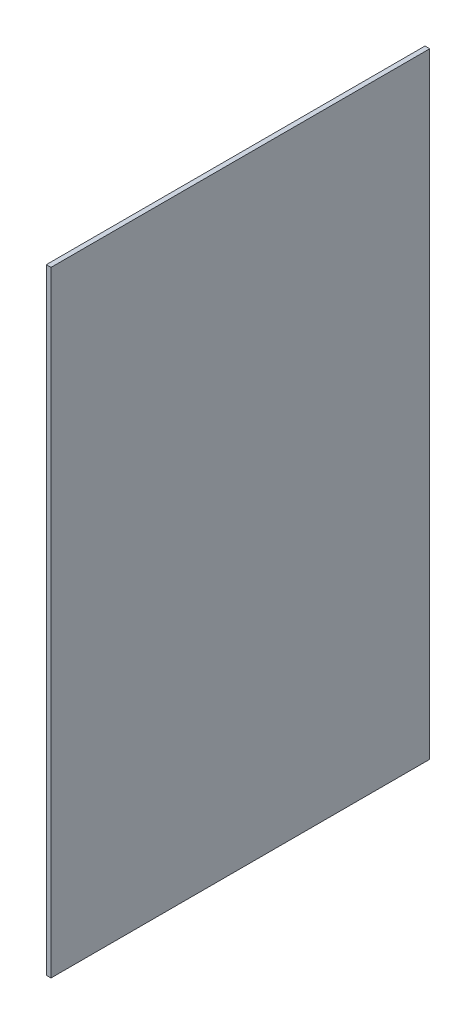
ISO-10303-21;
HEADER;
FILE_DESCRIPTION(('STEP AP214'),'2;1');
FILE_NAME('part.step','',(''),(''),'','','');
FILE_SCHEMA(('AUTOMOTIVE_DESIGN { 1 0 10303 214 1 1 1 1 }'));
ENDSEC;
DATA;
#1=APPLICATION_CONTEXT('core data for automotive mechanical design processes');
#2=APPLICATION_PROTOCOL_DEFINITION('international standard','automotive_design',2000,#1);
#3=PRODUCT_CONTEXT('',#1,'mechanical');
#4=PRODUCT('Part','Part','',(#3));
#5=PRODUCT_RELATED_PRODUCT_CATEGORY('part','',(#4));
#6=PRODUCT_DEFINITION_FORMATION('','',#4);
#7=PRODUCT_DEFINITION_CONTEXT('part definition',#1,'design');
#8=PRODUCT_DEFINITION('design','',#6,#7);
#9=PRODUCT_DEFINITION_SHAPE('','',#8);
#10=(LENGTH_UNIT() NAMED_UNIT(*) SI_UNIT(.MILLI.,.METRE.));
#11=(NAMED_UNIT(*) PLANE_ANGLE_UNIT() SI_UNIT($,.RADIAN.));
#12=(NAMED_UNIT(*) SI_UNIT($,.STERADIAN.) SOLID_ANGLE_UNIT());
#13=UNCERTAINTY_MEASURE_WITH_UNIT(LENGTH_MEASURE(1.E-05),#10,'distance_accuracy_value','');
#14=(GEOMETRIC_REPRESENTATION_CONTEXT(3) GLOBAL_UNCERTAINTY_ASSIGNED_CONTEXT((#13)) GLOBAL_UNIT_ASSIGNED_CONTEXT((#10,
#11,#12)) REPRESENTATION_CONTEXT('',''));
#15=CARTESIAN_POINT('',(0.,0.,0.));
#16=DIRECTION('',(0.,0.,1.));
#17=DIRECTION('',(1.,0.,0.));
#18=AXIS2_PLACEMENT_3D('',#15,#16,#17);
#19=CARTESIAN_POINT('',(0.,650.,400.));
#20=DIRECTION('',(1.,0.,0.));
#21=DIRECTION('',(0.,0.,-1.));
#22=AXIS2_PLACEMENT_3D('',#19,#20,#21);
#23=PLANE('',#22);
#24=DIRECTION('',(0.,-1.,0.));
#25=VECTOR('',#24,1.);
#26=CARTESIAN_POINT('',(0.,650.,0.));
#27=LINE('',#26,#25);
#28=CARTESIAN_POINT('',(0.,650.,0.));
#29=VERTEX_POINT('',#28);
#30=CARTESIAN_POINT('',(0.,0.,0.));
#31=VERTEX_POINT('',#30);
#32=EDGE_CURVE('E102',#29,#31,#27,.T.);
#33=ORIENTED_EDGE('',*,*,#32,.T.);
#34=DIRECTION('',(0.,0.,-1.));
#35=VECTOR('',#34,1.);
#36=CARTESIAN_POINT('',(0.,0.,400.));
#37=LINE('',#36,#35);
#38=CARTESIAN_POINT('',(0.,0.,400.));
#39=VERTEX_POINT('',#38);
#40=EDGE_CURVE('E11',#39,#31,#37,.T.);
#41=ORIENTED_EDGE('',*,*,#40,.F.);
#42=DIRECTION('',(0.,-1.,0.));
#43=VECTOR('',#42,1.);
#44=CARTESIAN_POINT('',(0.,650.,400.));
#45=LINE('',#44,#43);
#46=CARTESIAN_POINT('',(0.,650.,400.));
#47=VERTEX_POINT('',#46);
#48=EDGE_CURVE('E90',#47,#39,#45,.T.);
#49=ORIENTED_EDGE('',*,*,#48,.F.);
#50=DIRECTION('',(0.,0.,-1.));
#51=VECTOR('',#50,1.);
#52=CARTESIAN_POINT('',(0.,650.,400.));
#53=LINE('',#52,#51);
#54=EDGE_CURVE('E98',#47,#29,#53,.T.);
#55=ORIENTED_EDGE('',*,*,#54,.T.);
#56=EDGE_LOOP('',(#33,#41,#49,#55));
#57=FACE_BOUND('',#56,.T.);
#58=ADVANCED_FACE('F39',(#57),#23,.F.);
#59=CARTESIAN_POINT('',(0.,0.,400.));
#60=DIRECTION('',(0.,1.,0.));
#61=DIRECTION('',(0.,0.,1.));
#62=AXIS2_PLACEMENT_3D('',#59,#60,#61);
#63=PLANE('',#62);
#64=DIRECTION('',(1.,0.,0.));
#65=VECTOR('',#64,1.);
#66=CARTESIAN_POINT('',(0.,0.,0.));
#67=LINE('',#66,#65);
#68=CARTESIAN_POINT('',(5.,0.,0.));
#69=VERTEX_POINT('',#68);
#70=EDGE_CURVE('E94',#31,#69,#67,.T.);
#71=ORIENTED_EDGE('',*,*,#70,.T.);
#72=DIRECTION('',(0.,0.,-1.));
#73=VECTOR('',#72,1.);
#74=CARTESIAN_POINT('',(5.,0.,400.));
#75=LINE('',#74,#73);
#76=CARTESIAN_POINT('',(5.,0.,400.));
#77=VERTEX_POINT('',#76);
#78=EDGE_CURVE('E47',#77,#69,#75,.T.);
#79=ORIENTED_EDGE('',*,*,#78,.F.);
#80=DIRECTION('',(1.,0.,0.));
#81=VECTOR('',#80,1.);
#82=CARTESIAN_POINT('',(0.,0.,400.));
#83=LINE('',#82,#81);
#84=EDGE_CURVE('E85',#39,#77,#83,.T.);
#85=ORIENTED_EDGE('',*,*,#84,.F.);
#86=ORIENTED_EDGE('',*,*,#40,.T.);
#87=EDGE_LOOP('',(#71,#79,#85,#86));
#88=FACE_BOUND('',#87,.T.);
#89=ADVANCED_FACE('F93',(#88),#63,.F.);
#90=CARTESIAN_POINT('',(5.,0.,400.));
#91=DIRECTION('',(-1.,0.,0.));
#92=DIRECTION('',(0.,0.,1.));
#93=AXIS2_PLACEMENT_3D('',#90,#91,#92);
#94=PLANE('',#93);
#95=DIRECTION('',(0.,1.,0.));
#96=VECTOR('',#95,1.);
#97=CARTESIAN_POINT('',(5.,0.,0.));
#98=LINE('',#97,#96);
#99=CARTESIAN_POINT('',(5.,650.,0.));
#100=VERTEX_POINT('',#99);
#101=EDGE_CURVE('E72',#69,#100,#98,.T.);
#102=ORIENTED_EDGE('',*,*,#101,.T.);
#103=DIRECTION('',(0.,0.,-1.));
#104=VECTOR('',#103,1.);
#105=CARTESIAN_POINT('',(5.,650.,400.));
#106=LINE('',#105,#104);
#107=CARTESIAN_POINT('',(5.,650.,400.));
#108=VERTEX_POINT('',#107);
#109=EDGE_CURVE('E95',#108,#100,#106,.T.);
#110=ORIENTED_EDGE('',*,*,#109,.F.);
#111=DIRECTION('',(0.,1.,0.));
#112=VECTOR('',#111,1.);
#113=CARTESIAN_POINT('',(5.,0.,400.));
#114=LINE('',#113,#112);
#115=EDGE_CURVE('E88',#77,#108,#114,.T.);
#116=ORIENTED_EDGE('',*,*,#115,.F.);
#117=ORIENTED_EDGE('',*,*,#78,.T.);
#118=EDGE_LOOP('',(#102,#110,#116,#117));
#119=FACE_BOUND('',#118,.T.);
#120=ADVANCED_FACE('F96',(#119),#94,.F.);
#121=CARTESIAN_POINT('',(5.,650.,400.));
#122=DIRECTION('',(0.,-1.,0.));
#123=DIRECTION('',(0.,0.,-1.));
#124=AXIS2_PLACEMENT_3D('',#121,#122,#123);
#125=PLANE('',#124);
#126=DIRECTION('',(-1.,0.,0.));
#127=VECTOR('',#126,1.);
#128=CARTESIAN_POINT('',(5.,650.,0.));
#129=LINE('',#128,#127);
#130=EDGE_CURVE('E78',#100,#29,#129,.T.);
#131=ORIENTED_EDGE('',*,*,#130,.T.);
#132=ORIENTED_EDGE('',*,*,#54,.F.);
#133=DIRECTION('',(-1.,0.,0.));
#134=VECTOR('',#133,1.);
#135=CARTESIAN_POINT('',(5.,650.,400.));
#136=LINE('',#135,#134);
#137=EDGE_CURVE('E55',#108,#47,#136,.T.);
#138=ORIENTED_EDGE('',*,*,#137,.F.);
#139=ORIENTED_EDGE('',*,*,#109,.T.);
#140=EDGE_LOOP('',(#131,#132,#138,#139));
#141=FACE_BOUND('',#140,.T.);
#142=ADVANCED_FACE('F109',(#141),#125,.F.);
#143=CARTESIAN_POINT('',(0.,0.,400.));
#144=DIRECTION('',(0.,0.,1.));
#145=DIRECTION('',(1.,0.,0.));
#146=AXIS2_PLACEMENT_3D('',#143,#144,#145);
#147=PLANE('',#146);
#148=ORIENTED_EDGE('',*,*,#48,.T.);
#149=ORIENTED_EDGE('',*,*,#84,.T.);
#150=ORIENTED_EDGE('',*,*,#115,.T.);
#151=ORIENTED_EDGE('',*,*,#137,.T.);
#152=EDGE_LOOP('',(#148,#149,#150,#151));
#153=FACE_BOUND('',#152,.T.);
#154=ADVANCED_FACE('F86',(#153),#147,.T.);
#155=CARTESIAN_POINT('',(0.,0.,0.));
#156=DIRECTION('',(0.,0.,1.));
#157=DIRECTION('',(1.,0.,0.));
#158=AXIS2_PLACEMENT_3D('',#155,#156,#157);
#159=PLANE('',#158);
#160=ORIENTED_EDGE('',*,*,#32,.F.);
#161=ORIENTED_EDGE('',*,*,#130,.F.);
#162=ORIENTED_EDGE('',*,*,#101,.F.);
#163=ORIENTED_EDGE('',*,*,#70,.F.);
#164=EDGE_LOOP('',(#160,#161,#162,#163));
#165=FACE_BOUND('',#164,.T.);
#166=ADVANCED_FACE('F112',(#165),#159,.F.);
#167=CLOSED_SHELL('',(#58,#89,#120,#142,#154,#166));
#168=MANIFOLD_SOLID_BREP('B2',#167);
#169=ADVANCED_BREP_SHAPE_REPRESENTATION('',(#18,#168),#14);
#170=SHAPE_DEFINITION_REPRESENTATION(#9,#169);
ENDSEC;
END-ISO-10303-21;
